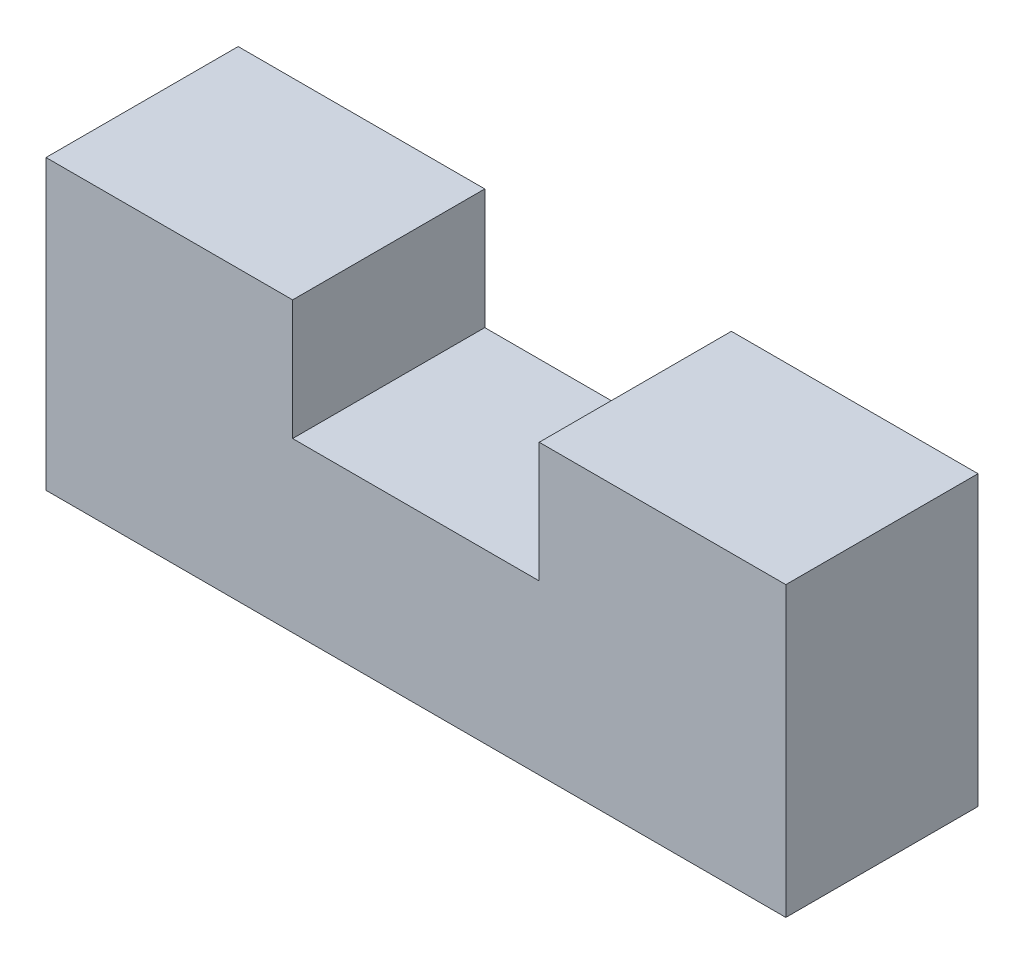
ISO-10303-21;
HEADER;
FILE_DESCRIPTION(('STEP AP214'),'2;1');
FILE_NAME('part.step','',(''),(''),'','','');
FILE_SCHEMA(('AUTOMOTIVE_DESIGN { 1 0 10303 214 1 1 1 1 }'));
ENDSEC;
DATA;
#1=APPLICATION_CONTEXT('core data for automotive mechanical design processes');
#2=APPLICATION_PROTOCOL_DEFINITION('international standard','automotive_design',2000,#1);
#3=PRODUCT_CONTEXT('',#1,'mechanical');
#4=PRODUCT('Part','Part','',(#3));
#5=PRODUCT_RELATED_PRODUCT_CATEGORY('part','',(#4));
#6=PRODUCT_DEFINITION_FORMATION('','',#4);
#7=PRODUCT_DEFINITION_CONTEXT('part definition',#1,'design');
#8=PRODUCT_DEFINITION('design','',#6,#7);
#9=PRODUCT_DEFINITION_SHAPE('','',#8);
#10=(LENGTH_UNIT() NAMED_UNIT(*) SI_UNIT(.MILLI.,.METRE.));
#11=(NAMED_UNIT(*) PLANE_ANGLE_UNIT() SI_UNIT($,.RADIAN.));
#12=(NAMED_UNIT(*) SI_UNIT($,.STERADIAN.) SOLID_ANGLE_UNIT());
#13=UNCERTAINTY_MEASURE_WITH_UNIT(LENGTH_MEASURE(1.E-05),#10,'distance_accuracy_value','');
#14=(GEOMETRIC_REPRESENTATION_CONTEXT(3) GLOBAL_UNCERTAINTY_ASSIGNED_CONTEXT((#13)) GLOBAL_UNIT_ASSIGNED_CONTEXT((#10,
#11,#12)) REPRESENTATION_CONTEXT('',''));
#15=CARTESIAN_POINT('',(0.,0.,0.));
#16=DIRECTION('',(0.,0.,1.));
#17=DIRECTION('',(1.,0.,0.));
#18=AXIS2_PLACEMENT_3D('',#15,#16,#17);
#19=CARTESIAN_POINT('',(25.6666666666667,25.,40.));
#20=DIRECTION('',(0.,-1.,0.));
#21=DIRECTION('',(1.,0.,0.));
#22=AXIS2_PLACEMENT_3D('',#19,#20,#21);
#23=PLANE('',#22);
#24=DIRECTION('',(-1.,0.,0.));
#25=VECTOR('',#24,1.);
#26=CARTESIAN_POINT('',(25.6666666666667,25.,0.));
#27=LINE('',#26,#25);
#28=CARTESIAN_POINT('',(77.,25.,0.));
#29=VERTEX_POINT('',#28);
#30=CARTESIAN_POINT('',(25.6666666666667,25.,0.));
#31=VERTEX_POINT('',#30);
#32=EDGE_CURVE('E140',#29,#31,#27,.T.);
#33=ORIENTED_EDGE('',*,*,#32,.T.);
#34=DIRECTION('',(0.,0.,-1.));
#35=VECTOR('',#34,1.);
#36=CARTESIAN_POINT('',(25.6666666666667,25.,40.));
#37=LINE('',#36,#35);
#38=CARTESIAN_POINT('',(25.6666666666667,25.,40.));
#39=VERTEX_POINT('',#38);
#40=EDGE_CURVE('E11',#39,#31,#37,.T.);
#41=ORIENTED_EDGE('',*,*,#40,.F.);
#42=DIRECTION('',(-1.,0.,0.));
#43=VECTOR('',#42,1.);
#44=CARTESIAN_POINT('',(25.6666666666667,25.,40.));
#45=LINE('',#44,#43);
#46=CARTESIAN_POINT('',(77.,25.,40.));
#47=VERTEX_POINT('',#46);
#48=EDGE_CURVE('E162',#47,#39,#45,.T.);
#49=ORIENTED_EDGE('',*,*,#48,.F.);
#50=DIRECTION('',(0.,0.,-1.));
#51=VECTOR('',#50,1.);
#52=CARTESIAN_POINT('',(77.,25.,40.));
#53=LINE('',#52,#51);
#54=EDGE_CURVE('E136',#47,#29,#53,.T.);
#55=ORIENTED_EDGE('',*,*,#54,.T.);
#56=EDGE_LOOP('',(#33,#41,#49,#55));
#57=FACE_BOUND('',#56,.T.);
#58=ADVANCED_FACE('F39',(#57),#23,.F.);
#59=CARTESIAN_POINT('',(25.6666666666667,0.,40.));
#60=DIRECTION('',(1.,0.,0.));
#61=DIRECTION('',(0.,1.,0.));
#62=AXIS2_PLACEMENT_3D('',#59,#60,#61);
#63=PLANE('',#62);
#64=DIRECTION('',(0.,-1.,0.));
#65=VECTOR('',#64,1.);
#66=CARTESIAN_POINT('',(25.6666666666667,0.,0.));
#67=LINE('',#66,#65);
#68=CARTESIAN_POINT('',(25.6666666666667,0.,0.));
#69=VERTEX_POINT('',#68);
#70=EDGE_CURVE('E144',#31,#69,#67,.T.);
#71=ORIENTED_EDGE('',*,*,#70,.T.);
#72=DIRECTION('',(0.,0.,-1.));
#73=VECTOR('',#72,1.);
#74=CARTESIAN_POINT('',(25.6666666666667,0.,40.));
#75=LINE('',#74,#73);
#76=CARTESIAN_POINT('',(25.6666666666667,0.,40.));
#77=VERTEX_POINT('',#76);
#78=EDGE_CURVE('E48',#77,#69,#75,.T.);
#79=ORIENTED_EDGE('',*,*,#78,.F.);
#80=DIRECTION('',(0.,-1.,0.));
#81=VECTOR('',#80,1.);
#82=CARTESIAN_POINT('',(25.6666666666667,0.,40.));
#83=LINE('',#82,#81);
#84=EDGE_CURVE('E99',#39,#77,#83,.T.);
#85=ORIENTED_EDGE('',*,*,#84,.F.);
#86=ORIENTED_EDGE('',*,*,#40,.T.);
#87=EDGE_LOOP('',(#71,#79,#85,#86));
#88=FACE_BOUND('',#87,.T.);
#89=ADVANCED_FACE('F208',(#88),#63,.F.);
#90=CARTESIAN_POINT('',(25.6666666666667,0.,40.));
#91=DIRECTION('',(0.,-1.,0.));
#92=DIRECTION('',(1.,0.,0.));
#93=AXIS2_PLACEMENT_3D('',#90,#91,#92);
#94=PLANE('',#93);
#95=DIRECTION('',(-1.,0.,0.));
#96=VECTOR('',#95,1.);
#97=CARTESIAN_POINT('',(25.6666666666667,0.,0.));
#98=LINE('',#97,#96);
#99=CARTESIAN_POINT('',(-25.6666666666667,0.,0.));
#100=VERTEX_POINT('',#99);
#101=EDGE_CURVE('E147',#69,#100,#98,.T.);
#102=ORIENTED_EDGE('',*,*,#101,.T.);
#103=DIRECTION('',(0.,0.,-1.));
#104=VECTOR('',#103,1.);
#105=CARTESIAN_POINT('',(-25.6666666666667,0.,40.));
#106=LINE('',#105,#104);
#107=CARTESIAN_POINT('',(-25.6666666666667,0.,40.));
#108=VERTEX_POINT('',#107);
#109=EDGE_CURVE('E173',#108,#100,#106,.T.);
#110=ORIENTED_EDGE('',*,*,#109,.F.);
#111=DIRECTION('',(-1.,0.,0.));
#112=VECTOR('',#111,1.);
#113=CARTESIAN_POINT('',(25.6666666666667,0.,40.));
#114=LINE('',#113,#112);
#115=EDGE_CURVE('E183',#77,#108,#114,.T.);
#116=ORIENTED_EDGE('',*,*,#115,.F.);
#117=ORIENTED_EDGE('',*,*,#78,.T.);
#118=EDGE_LOOP('',(#102,#110,#116,#117));
#119=FACE_BOUND('',#118,.T.);
#120=ADVANCED_FACE('F181',(#119),#94,.F.);
#121=CARTESIAN_POINT('',(-25.6666666666667,0.,40.));
#122=DIRECTION('',(-1.,0.,0.));
#123=DIRECTION('',(0.,-1.,0.));
#124=AXIS2_PLACEMENT_3D('',#121,#122,#123);
#125=PLANE('',#124);
#126=DIRECTION('',(0.,1.,0.));
#127=VECTOR('',#126,1.);
#128=CARTESIAN_POINT('',(-25.6666666666667,0.,0.));
#129=LINE('',#128,#127);
#130=CARTESIAN_POINT('',(-25.6666666666667,25.,0.));
#131=VERTEX_POINT('',#130);
#132=EDGE_CURVE('E150',#100,#131,#129,.T.);
#133=ORIENTED_EDGE('',*,*,#132,.T.);
#134=DIRECTION('',(0.,0.,-1.));
#135=VECTOR('',#134,1.);
#136=CARTESIAN_POINT('',(-25.6666666666667,25.,40.));
#137=LINE('',#136,#135);
#138=CARTESIAN_POINT('',(-25.6666666666667,25.,40.));
#139=VERTEX_POINT('',#138);
#140=EDGE_CURVE('E169',#139,#131,#137,.T.);
#141=ORIENTED_EDGE('',*,*,#140,.F.);
#142=DIRECTION('',(0.,1.,0.));
#143=VECTOR('',#142,1.);
#144=CARTESIAN_POINT('',(-25.6666666666667,0.,40.));
#145=LINE('',#144,#143);
#146=EDGE_CURVE('E196',#108,#139,#145,.T.);
#147=ORIENTED_EDGE('',*,*,#146,.F.);
#148=ORIENTED_EDGE('',*,*,#109,.T.);
#149=EDGE_LOOP('',(#133,#141,#147,#148));
#150=FACE_BOUND('',#149,.T.);
#151=ADVANCED_FACE('F191',(#150),#125,.F.);
#152=CARTESIAN_POINT('',(-25.6666666666667,25.,40.));
#153=DIRECTION('',(0.,-1.,0.));
#154=DIRECTION('',(1.,0.,0.));
#155=AXIS2_PLACEMENT_3D('',#152,#153,#154);
#156=PLANE('',#155);
#157=DIRECTION('',(-1.,0.,0.));
#158=VECTOR('',#157,1.);
#159=CARTESIAN_POINT('',(-25.6666666666667,25.,0.));
#160=LINE('',#159,#158);
#161=CARTESIAN_POINT('',(-77.,25.,0.));
#162=VERTEX_POINT('',#161);
#163=EDGE_CURVE('E153',#131,#162,#160,.T.);
#164=ORIENTED_EDGE('',*,*,#163,.T.);
#165=DIRECTION('',(0.,0.,-1.));
#166=VECTOR('',#165,1.);
#167=CARTESIAN_POINT('',(-77.,25.,40.));
#168=LINE('',#167,#166);
#169=CARTESIAN_POINT('',(-77.,25.,40.));
#170=VERTEX_POINT('',#169);
#171=EDGE_CURVE('E129',#170,#162,#168,.T.);
#172=ORIENTED_EDGE('',*,*,#171,.F.);
#173=DIRECTION('',(-1.,0.,0.));
#174=VECTOR('',#173,1.);
#175=CARTESIAN_POINT('',(-25.6666666666667,25.,40.));
#176=LINE('',#175,#174);
#177=EDGE_CURVE('E118',#139,#170,#176,.T.);
#178=ORIENTED_EDGE('',*,*,#177,.F.);
#179=ORIENTED_EDGE('',*,*,#140,.T.);
#180=EDGE_LOOP('',(#164,#172,#178,#179));
#181=FACE_BOUND('',#180,.T.);
#182=ADVANCED_FACE('F194',(#181),#156,.F.);
#183=CARTESIAN_POINT('',(-77.,25.,40.));
#184=DIRECTION('',(1.,0.,0.));
#185=DIRECTION('',(0.,0.,-1.));
#186=AXIS2_PLACEMENT_3D('',#183,#184,#185);
#187=PLANE('',#186);
#188=DIRECTION('',(0.,-1.,0.));
#189=VECTOR('',#188,1.);
#190=CARTESIAN_POINT('',(-77.,25.,0.));
#191=LINE('',#190,#189);
#192=CARTESIAN_POINT('',(-77.,-35.,0.));
#193=VERTEX_POINT('',#192);
#194=EDGE_CURVE('E127',#162,#193,#191,.T.);
#195=ORIENTED_EDGE('',*,*,#194,.T.);
#196=DIRECTION('',(0.,0.,-1.));
#197=VECTOR('',#196,1.);
#198=CARTESIAN_POINT('',(-77.,-35.,40.));
#199=LINE('',#198,#197);
#200=CARTESIAN_POINT('',(-77.,-35.,40.));
#201=VERTEX_POINT('',#200);
#202=EDGE_CURVE('E124',#201,#193,#199,.T.);
#203=ORIENTED_EDGE('',*,*,#202,.F.);
#204=DIRECTION('',(0.,-1.,0.));
#205=VECTOR('',#204,1.);
#206=CARTESIAN_POINT('',(-77.,25.,40.));
#207=LINE('',#206,#205);
#208=EDGE_CURVE('E112',#170,#201,#207,.T.);
#209=ORIENTED_EDGE('',*,*,#208,.F.);
#210=ORIENTED_EDGE('',*,*,#171,.T.);
#211=EDGE_LOOP('',(#195,#203,#209,#210));
#212=FACE_BOUND('',#211,.T.);
#213=ADVANCED_FACE('F125',(#212),#187,.F.);
#214=CARTESIAN_POINT('',(-77.,-35.,40.));
#215=DIRECTION('',(0.,1.,0.));
#216=DIRECTION('',(-1.,0.,0.));
#217=AXIS2_PLACEMENT_3D('',#214,#215,#216);
#218=PLANE('',#217);
#219=DIRECTION('',(1.,0.,0.));
#220=VECTOR('',#219,1.);
#221=CARTESIAN_POINT('',(-77.,-35.,0.));
#222=LINE('',#221,#220);
#223=CARTESIAN_POINT('',(77.,-35.,0.));
#224=VERTEX_POINT('',#223);
#225=EDGE_CURVE('E85',#193,#224,#222,.T.);
#226=ORIENTED_EDGE('',*,*,#225,.T.);
#227=DIRECTION('',(0.,0.,-1.));
#228=VECTOR('',#227,1.);
#229=CARTESIAN_POINT('',(77.,-35.,40.));
#230=LINE('',#229,#228);
#231=CARTESIAN_POINT('',(77.,-35.,40.));
#232=VERTEX_POINT('',#231);
#233=EDGE_CURVE('E130',#232,#224,#230,.T.);
#234=ORIENTED_EDGE('',*,*,#233,.F.);
#235=DIRECTION('',(1.,0.,0.));
#236=VECTOR('',#235,1.);
#237=CARTESIAN_POINT('',(-77.,-35.,40.));
#238=LINE('',#237,#236);
#239=EDGE_CURVE('E116',#201,#232,#238,.T.);
#240=ORIENTED_EDGE('',*,*,#239,.F.);
#241=ORIENTED_EDGE('',*,*,#202,.T.);
#242=EDGE_LOOP('',(#226,#234,#240,#241));
#243=FACE_BOUND('',#242,.T.);
#244=ADVANCED_FACE('F132',(#243),#218,.F.);
#245=CARTESIAN_POINT('',(77.,25.,40.));
#246=DIRECTION('',(-1.,0.,0.));
#247=DIRECTION('',(0.,0.,1.));
#248=AXIS2_PLACEMENT_3D('',#245,#246,#247);
#249=PLANE('',#248);
#250=DIRECTION('',(0.,1.,0.));
#251=VECTOR('',#250,1.);
#252=CARTESIAN_POINT('',(77.,25.,0.));
#253=LINE('',#252,#251);
#254=EDGE_CURVE('E91',#224,#29,#253,.T.);
#255=ORIENTED_EDGE('',*,*,#254,.T.);
#256=ORIENTED_EDGE('',*,*,#54,.F.);
#257=DIRECTION('',(0.,1.,0.));
#258=VECTOR('',#257,1.);
#259=CARTESIAN_POINT('',(77.,25.,40.));
#260=LINE('',#259,#258);
#261=EDGE_CURVE('E56',#232,#47,#260,.T.);
#262=ORIENTED_EDGE('',*,*,#261,.F.);
#263=ORIENTED_EDGE('',*,*,#233,.T.);
#264=EDGE_LOOP('',(#255,#256,#262,#263));
#265=FACE_BOUND('',#264,.T.);
#266=ADVANCED_FACE('F224',(#265),#249,.F.);
#267=CARTESIAN_POINT('',(0.,0.,40.));
#268=DIRECTION('',(0.,0.,-1.));
#269=DIRECTION('',(-1.,0.,0.));
#270=AXIS2_PLACEMENT_3D('',#267,#268,#269);
#271=PLANE('',#270);
#272=ORIENTED_EDGE('',*,*,#48,.T.);
#273=ORIENTED_EDGE('',*,*,#84,.T.);
#274=ORIENTED_EDGE('',*,*,#115,.T.);
#275=ORIENTED_EDGE('',*,*,#146,.T.);
#276=ORIENTED_EDGE('',*,*,#177,.T.);
#277=ORIENTED_EDGE('',*,*,#208,.T.);
#278=ORIENTED_EDGE('',*,*,#239,.T.);
#279=ORIENTED_EDGE('',*,*,#261,.T.);
#280=EDGE_LOOP('',(#272,#273,#274,#275,#276,#277,#278,#279));
#281=FACE_BOUND('',#280,.T.);
#282=ADVANCED_FACE('F114',(#281),#271,.F.);
#283=CARTESIAN_POINT('',(0.,0.,0.));
#284=DIRECTION('',(0.,0.,-1.));
#285=DIRECTION('',(-1.,0.,0.));
#286=AXIS2_PLACEMENT_3D('',#283,#284,#285);
#287=PLANE('',#286);
#288=ORIENTED_EDGE('',*,*,#32,.F.);
#289=ORIENTED_EDGE('',*,*,#254,.F.);
#290=ORIENTED_EDGE('',*,*,#225,.F.);
#291=ORIENTED_EDGE('',*,*,#194,.F.);
#292=ORIENTED_EDGE('',*,*,#163,.F.);
#293=ORIENTED_EDGE('',*,*,#132,.F.);
#294=ORIENTED_EDGE('',*,*,#101,.F.);
#295=ORIENTED_EDGE('',*,*,#70,.F.);
#296=EDGE_LOOP('',(#288,#289,#290,#291,#292,#293,#294,#295));
#297=FACE_BOUND('',#296,.T.);
#298=ADVANCED_FACE('F187',(#297),#287,.T.);
#299=CLOSED_SHELL('',(#58,#89,#120,#151,#182,#213,#244,#266,#282,#298));
#300=MANIFOLD_SOLID_BREP('B2',#299);
#301=ADVANCED_BREP_SHAPE_REPRESENTATION('',(#18,#300),#14);
#302=SHAPE_DEFINITION_REPRESENTATION(#9,#301);
ENDSEC;
END-ISO-10303-21;
